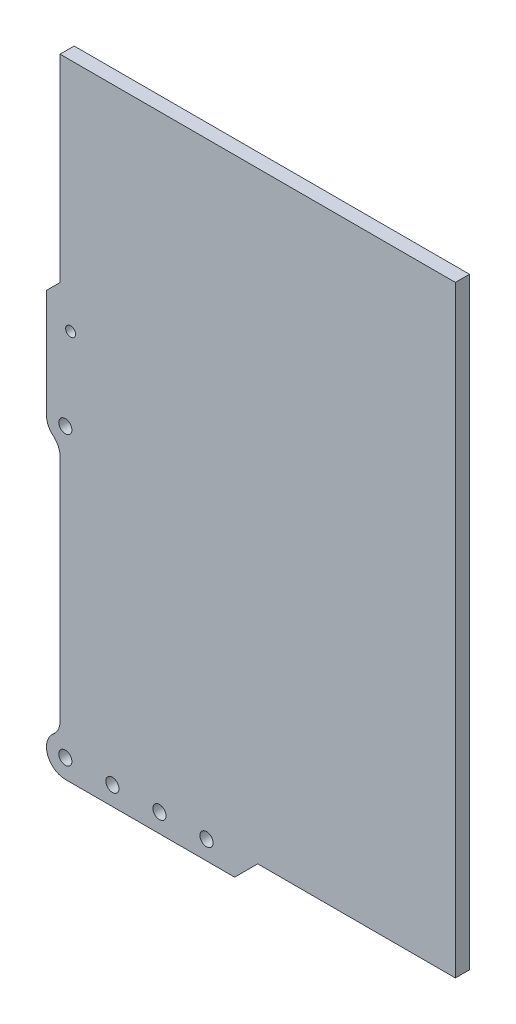
ISO-10303-21;
HEADER;
FILE_DESCRIPTION(('STEP AP214'),'2;1');
FILE_NAME('part.step','',(''),(''),'','','');
FILE_SCHEMA(('AUTOMOTIVE_DESIGN { 1 0 10303 214 1 1 1 1 }'));
ENDSEC;
DATA;
#1=APPLICATION_CONTEXT('core data for automotive mechanical design processes');
#2=APPLICATION_PROTOCOL_DEFINITION('international standard','automotive_design',2000,#1);
#3=PRODUCT_CONTEXT('',#1,'mechanical');
#4=PRODUCT('Part','Part','',(#3));
#5=PRODUCT_RELATED_PRODUCT_CATEGORY('part','',(#4));
#6=PRODUCT_DEFINITION_FORMATION('','',#4);
#7=PRODUCT_DEFINITION_CONTEXT('part definition',#1,'design');
#8=PRODUCT_DEFINITION('design','',#6,#7);
#9=PRODUCT_DEFINITION_SHAPE('','',#8);
#10=(LENGTH_UNIT() NAMED_UNIT(*) SI_UNIT(.MILLI.,.METRE.));
#11=(NAMED_UNIT(*) PLANE_ANGLE_UNIT() SI_UNIT($,.RADIAN.));
#12=(NAMED_UNIT(*) SI_UNIT($,.STERADIAN.) SOLID_ANGLE_UNIT());
#13=UNCERTAINTY_MEASURE_WITH_UNIT(LENGTH_MEASURE(1.E-05),#10,'distance_accuracy_value','');
#14=(GEOMETRIC_REPRESENTATION_CONTEXT(3) GLOBAL_UNCERTAINTY_ASSIGNED_CONTEXT((#13)) GLOBAL_UNIT_ASSIGNED_CONTEXT((#10,
#11,#12)) REPRESENTATION_CONTEXT('',''));
#15=CARTESIAN_POINT('',(0.,0.,0.));
#16=DIRECTION('',(0.,0.,1.));
#17=DIRECTION('',(1.,0.,0.));
#18=AXIS2_PLACEMENT_3D('',#15,#16,#17);
#19=CARTESIAN_POINT('',(1.12,60.1,0.));
#20=DIRECTION('',(0.,0.,1.));
#21=DIRECTION('',(1.,0.,0.));
#22=AXIS2_PLACEMENT_3D('',#19,#20,#21);
#23=PLANE('',#22);
#24=CARTESIAN_POINT('',(31.12,-0.900000000000001,0.));
#25=DIRECTION('',(0.,0.,-1.));
#26=DIRECTION('',(-1.,0.,0.));
#27=AXIS2_PLACEMENT_3D('',#24,#25,#26);
#28=CIRCLE('',#27,1.4);
#29=CARTESIAN_POINT('',(29.72,-0.900000000000001,0.));
#30=VERTEX_POINT('',#29);
#31=EDGE_CURVE('E254',#30,#30,#28,.F.);
#32=ORIENTED_EDGE('',*,*,#31,.T.);
#33=EDGE_LOOP('',(#32));
#34=FACE_BOUND('',#33,.T.);
#35=CARTESIAN_POINT('',(11.12,-0.900000000000001,0.));
#36=DIRECTION('',(0.,0.,-1.));
#37=DIRECTION('',(-1.,0.,0.));
#38=AXIS2_PLACEMENT_3D('',#35,#36,#37);
#39=CIRCLE('',#38,1.4);
#40=CARTESIAN_POINT('',(9.72,-0.900000000000001,0.));
#41=VERTEX_POINT('',#40);
#42=EDGE_CURVE('E257',#41,#41,#39,.F.);
#43=ORIENTED_EDGE('',*,*,#42,.T.);
#44=EDGE_LOOP('',(#43));
#45=FACE_BOUND('',#44,.T.);
#46=CARTESIAN_POINT('',(1.12,-0.900000000000001,0.));
#47=DIRECTION('',(0.,0.,-1.));
#48=DIRECTION('',(-1.,0.,0.));
#49=AXIS2_PLACEMENT_3D('',#46,#47,#48);
#50=CIRCLE('',#49,1.4);
#51=CARTESIAN_POINT('',(-0.279999999999999,-0.900000000000001,0.));
#52=VERTEX_POINT('',#51);
#53=EDGE_CURVE('E200',#52,#52,#50,.F.);
#54=ORIENTED_EDGE('',*,*,#53,.T.);
#55=EDGE_LOOP('',(#54));
#56=FACE_BOUND('',#55,.T.);
#57=DIRECTION('',(1.,0.,0.));
#58=VECTOR('',#57,1.);
#59=CARTESIAN_POINT('',(42.,0.,0.));
#60=LINE('',#59,#58);
#61=CARTESIAN_POINT('',(84.,0.,0.));
#62=VERTEX_POINT('',#61);
#63=CARTESIAN_POINT('',(42.,0.,0.));
#64=VERTEX_POINT('',#63);
#65=EDGE_CURVE('E185',#62,#64,#60,.F.);
#66=ORIENTED_EDGE('',*,*,#65,.T.);
#67=DIRECTION('',(-0.707106781186547,-0.707106781186549,0.));
#68=VECTOR('',#67,1.);
#69=CARTESIAN_POINT('',(37.1,-4.9,0.));
#70=LINE('',#69,#68);
#71=CARTESIAN_POINT('',(37.1,-4.9,0.));
#72=VERTEX_POINT('',#71);
#73=EDGE_CURVE('E210',#64,#72,#70,.T.);
#74=ORIENTED_EDGE('',*,*,#73,.T.);
#75=DIRECTION('',(-1.,0.,0.));
#76=VECTOR('',#75,1.);
#77=CARTESIAN_POINT('',(1.12,-4.9,0.));
#78=LINE('',#77,#76);
#79=CARTESIAN_POINT('',(1.12,-4.9,0.));
#80=VERTEX_POINT('',#79);
#81=EDGE_CURVE('E203',#72,#80,#78,.T.);
#82=ORIENTED_EDGE('',*,*,#81,.T.);
#83=CARTESIAN_POINT('',(1.12,-0.900000000000001,0.));
#84=DIRECTION('',(0.,0.,-1.));
#85=DIRECTION('',(-1.,0.,0.));
#86=AXIS2_PLACEMENT_3D('',#83,#84,#85);
#87=CIRCLE('',#86,4.);
#88=CARTESIAN_POINT('',(-1.44,2.17349963396777,0.));
#89=VERTEX_POINT('',#88);
#90=EDGE_CURVE('E262',#89,#80,#87,.F.);
#91=ORIENTED_EDGE('',*,*,#90,.F.);
#92=CARTESIAN_POINT('',(-4.,5.24699926793553,0.));
#93=DIRECTION('',(0.,0.,-1.));
#94=DIRECTION('',(-1.,0.,0.));
#95=AXIS2_PLACEMENT_3D('',#92,#93,#94);
#96=CIRCLE('',#95,4.);
#97=CARTESIAN_POINT('',(0.,5.24699926793553,0.));
#98=VERTEX_POINT('',#97);
#99=EDGE_CURVE('E265',#89,#98,#96,.F.);
#100=ORIENTED_EDGE('',*,*,#99,.T.);
#101=DIRECTION('',(0.,1.,0.));
#102=VECTOR('',#101,1.);
#103=CARTESIAN_POINT('',(0.,53.9530007320645,0.));
#104=LINE('',#103,#102);
#105=CARTESIAN_POINT('',(0.,53.9530007320645,0.));
#106=VERTEX_POINT('',#105);
#107=EDGE_CURVE('E126',#98,#106,#104,.T.);
#108=ORIENTED_EDGE('',*,*,#107,.T.);
#109=CARTESIAN_POINT('',(-4.,53.9530007320645,0.));
#110=DIRECTION('',(0.,0.,-1.));
#111=DIRECTION('',(-1.,0.,0.));
#112=AXIS2_PLACEMENT_3D('',#109,#110,#111);
#113=CIRCLE('',#112,4.);
#114=CARTESIAN_POINT('',(-1.44,57.0265003660322,0.));
#115=VERTEX_POINT('',#114);
#116=EDGE_CURVE('E122',#106,#115,#113,.F.);
#117=ORIENTED_EDGE('',*,*,#116,.T.);
#118=CARTESIAN_POINT('',(1.12,60.1,0.));
#119=DIRECTION('',(0.,0.,-1.));
#120=DIRECTION('',(-1.,0.,0.));
#121=AXIS2_PLACEMENT_3D('',#118,#119,#120);
#122=CIRCLE('',#121,3.99999999999999);
#123=CARTESIAN_POINT('',(-2.87999999999999,60.1,0.));
#124=VERTEX_POINT('',#123);
#125=EDGE_CURVE('E109',#124,#115,#122,.F.);
#126=ORIENTED_EDGE('',*,*,#125,.F.);
#127=DIRECTION('',(0.,1.,0.));
#128=VECTOR('',#127,1.);
#129=CARTESIAN_POINT('',(-2.87999999999998,67.1,0.));
#130=LINE('',#129,#128);
#131=CARTESIAN_POINT('',(-2.87999999999995,83.1,0.));
#132=VERTEX_POINT('',#131);
#133=EDGE_CURVE('E119',#124,#132,#130,.T.);
#134=ORIENTED_EDGE('',*,*,#133,.T.);
#135=DIRECTION('',(0.707106781186544,0.707106781186551,0.));
#136=VECTOR('',#135,1.);
#137=CARTESIAN_POINT('',(-2.87999999999997,83.1,0.));
#138=LINE('',#137,#136);
#139=CARTESIAN_POINT('',(0.,85.98,0.));
#140=VERTEX_POINT('',#139);
#141=EDGE_CURVE('E142',#132,#140,#138,.T.);
#142=ORIENTED_EDGE('',*,*,#141,.T.);
#143=DIRECTION('',(0.,1.,0.));
#144=VECTOR('',#143,1.);
#145=CARTESIAN_POINT('',(0.,128.,0.));
#146=LINE('',#145,#144);
#147=CARTESIAN_POINT('',(0.,128.,0.));
#148=VERTEX_POINT('',#147);
#149=EDGE_CURVE('E154',#140,#148,#146,.T.);
#150=ORIENTED_EDGE('',*,*,#149,.T.);
#151=DIRECTION('',(1.,0.,0.));
#152=VECTOR('',#151,1.);
#153=CARTESIAN_POINT('',(0.,128.,0.));
#154=LINE('',#153,#152);
#155=CARTESIAN_POINT('',(84.,128.,0.));
#156=VERTEX_POINT('',#155);
#157=EDGE_CURVE('E164',#148,#156,#154,.T.);
#158=ORIENTED_EDGE('',*,*,#157,.T.);
#159=DIRECTION('',(0.,1.,0.));
#160=VECTOR('',#159,1.);
#161=CARTESIAN_POINT('',(84.,0.,0.));
#162=LINE('',#161,#160);
#163=EDGE_CURVE('E174',#156,#62,#162,.F.);
#164=ORIENTED_EDGE('',*,*,#163,.T.);
#165=EDGE_LOOP('',(#66,#74,#82,#91,#100,#108,#117,#126,#134,#142,#150,#158,#164));
#166=FACE_BOUND('',#165,.T.);
#167=CARTESIAN_POINT('',(1.12,60.1,0.));
#168=DIRECTION('',(0.,0.,-1.));
#169=DIRECTION('',(-1.,0.,0.));
#170=AXIS2_PLACEMENT_3D('',#167,#168,#169);
#171=CIRCLE('',#170,1.4);
#172=CARTESIAN_POINT('',(-0.279999999999999,60.1,0.));
#173=VERTEX_POINT('',#172);
#174=EDGE_CURVE('E196',#173,#173,#171,.F.);
#175=ORIENTED_EDGE('',*,*,#174,.T.);
#176=EDGE_LOOP('',(#175));
#177=FACE_BOUND('',#176,.T.);
#178=CARTESIAN_POINT('',(21.12,-0.900000000000001,0.));
#179=DIRECTION('',(0.,0.,-1.));
#180=DIRECTION('',(-1.,0.,0.));
#181=AXIS2_PLACEMENT_3D('',#178,#179,#180);
#182=CIRCLE('',#181,1.4);
#183=CARTESIAN_POINT('',(19.72,-0.900000000000001,0.));
#184=VERTEX_POINT('',#183);
#185=EDGE_CURVE('E268',#184,#184,#182,.F.);
#186=ORIENTED_EDGE('',*,*,#185,.T.);
#187=EDGE_LOOP('',(#186));
#188=FACE_BOUND('',#187,.T.);
#189=CARTESIAN_POINT('',(2.24065736562365,78.099836862285,0.));
#190=DIRECTION('',(0.,0.,1.));
#191=DIRECTION('',(1.,0.,0.));
#192=AXIS2_PLACEMENT_3D('',#189,#190,#191);
#193=CIRCLE('',#192,1.05);
#194=CARTESIAN_POINT('',(3.29065736562365,78.099836862285,0.));
#195=VERTEX_POINT('',#194);
#196=EDGE_CURVE('E19',#195,#195,#193,.T.);
#197=ORIENTED_EDGE('',*,*,#196,.T.);
#198=EDGE_LOOP('',(#197));
#199=FACE_BOUND('',#198,.T.);
#200=ADVANCED_FACE('F16',(#34,#45,#56,#166,#177,#188,#199),#23,.F.);
#201=CARTESIAN_POINT('',(2.24065736562365,78.099836862285,-0.00100000000000013));
#202=DIRECTION('',(0.,0.,1.));
#203=DIRECTION('',(1.,0.,0.));
#204=AXIS2_PLACEMENT_3D('',#201,#202,#203);
#205=CYLINDRICAL_SURFACE('',#204,1.05);
#206=CARTESIAN_POINT('',(2.24065736562365,78.099836862285,3.));
#207=DIRECTION('',(0.,0.,1.));
#208=DIRECTION('',(1.,0.,0.));
#209=AXIS2_PLACEMENT_3D('',#206,#207,#208);
#210=CIRCLE('',#209,1.05);
#211=CARTESIAN_POINT('',(3.29065736562365,78.099836862285,3.));
#212=VERTEX_POINT('',#211);
#213=EDGE_CURVE('E251',#212,#212,#210,.F.);
#214=ORIENTED_EDGE('',*,*,#213,.F.);
#215=EDGE_LOOP('',(#214));
#216=FACE_BOUND('',#215,.T.);
#217=ORIENTED_EDGE('',*,*,#196,.F.);
#218=EDGE_LOOP('',(#217));
#219=FACE_BOUND('',#218,.T.);
#220=ADVANCED_FACE('F276',(#216,#219),#205,.F.);
#221=CARTESIAN_POINT('',(21.12,-0.900000000000001,3.));
#222=DIRECTION('',(0.,0.,-1.));
#223=DIRECTION('',(-1.,0.,0.));
#224=AXIS2_PLACEMENT_3D('',#221,#222,#223);
#225=CYLINDRICAL_SURFACE('',#224,1.4);
#226=CARTESIAN_POINT('',(21.12,-0.900000000000001,3.));
#227=DIRECTION('',(0.,0.,-1.));
#228=DIRECTION('',(-1.,0.,0.));
#229=AXIS2_PLACEMENT_3D('',#226,#227,#228);
#230=CIRCLE('',#229,1.4);
#231=CARTESIAN_POINT('',(19.72,-0.900000000000001,3.));
#232=VERTEX_POINT('',#231);
#233=EDGE_CURVE('E248',#232,#232,#230,.T.);
#234=ORIENTED_EDGE('',*,*,#233,.F.);
#235=EDGE_LOOP('',(#234));
#236=FACE_BOUND('',#235,.T.);
#237=ORIENTED_EDGE('',*,*,#185,.F.);
#238=EDGE_LOOP('',(#237));
#239=FACE_BOUND('',#238,.T.);
#240=ADVANCED_FACE('F278',(#236,#239),#225,.F.);
#241=CARTESIAN_POINT('',(1.12,60.1,3.));
#242=DIRECTION('',(0.,0.,-1.));
#243=DIRECTION('',(-1.,0.,0.));
#244=AXIS2_PLACEMENT_3D('',#241,#242,#243);
#245=CYLINDRICAL_SURFACE('',#244,1.4);
#246=CARTESIAN_POINT('',(1.12,60.1,3.));
#247=DIRECTION('',(0.,0.,-1.));
#248=DIRECTION('',(-1.,0.,0.));
#249=AXIS2_PLACEMENT_3D('',#246,#247,#248);
#250=CIRCLE('',#249,1.4);
#251=CARTESIAN_POINT('',(-0.279999999999999,60.1,3.));
#252=VERTEX_POINT('',#251);
#253=EDGE_CURVE('E179',#252,#252,#250,.T.);
#254=ORIENTED_EDGE('',*,*,#253,.F.);
#255=EDGE_LOOP('',(#254));
#256=FACE_BOUND('',#255,.T.);
#257=ORIENTED_EDGE('',*,*,#174,.F.);
#258=EDGE_LOOP('',(#257));
#259=FACE_BOUND('',#258,.T.);
#260=ADVANCED_FACE('F285',(#256,#259),#245,.F.);
#261=CARTESIAN_POINT('',(84.,0.,3.));
#262=DIRECTION('',(-1.,0.,0.));
#263=DIRECTION('',(0.,0.,1.));
#264=AXIS2_PLACEMENT_3D('',#261,#262,#263);
#265=PLANE('',#264);
#266=DIRECTION('',(0.,0.,-1.));
#267=VECTOR('',#266,1.);
#268=CARTESIAN_POINT('',(84.,128.,3.));
#269=LINE('',#268,#267);
#270=CARTESIAN_POINT('',(84.,128.,3.));
#271=VERTEX_POINT('',#270);
#272=EDGE_CURVE('E172',#156,#271,#269,.F.);
#273=ORIENTED_EDGE('',*,*,#272,.T.);
#274=DIRECTION('',(0.,1.,0.));
#275=VECTOR('',#274,1.);
#276=CARTESIAN_POINT('',(84.,60.1,3.));
#277=LINE('',#276,#275);
#278=CARTESIAN_POINT('',(84.,0.,3.));
#279=VERTEX_POINT('',#278);
#280=EDGE_CURVE('E169',#279,#271,#277,.T.);
#281=ORIENTED_EDGE('',*,*,#280,.F.);
#282=DIRECTION('',(0.,0.,1.));
#283=VECTOR('',#282,1.);
#284=CARTESIAN_POINT('',(84.,0.,3.));
#285=LINE('',#284,#283);
#286=EDGE_CURVE('E182',#279,#62,#285,.F.);
#287=ORIENTED_EDGE('',*,*,#286,.T.);
#288=ORIENTED_EDGE('',*,*,#163,.F.);
#289=EDGE_LOOP('',(#273,#281,#287,#288));
#290=FACE_BOUND('',#289,.T.);
#291=ADVANCED_FACE('F352',(#290),#265,.F.);
#292=CARTESIAN_POINT('',(0.,128.,3.));
#293=DIRECTION('',(0.,-1.,0.));
#294=DIRECTION('',(0.,0.,-1.));
#295=AXIS2_PLACEMENT_3D('',#292,#293,#294);
#296=PLANE('',#295);
#297=DIRECTION('',(0.,0.,-1.));
#298=VECTOR('',#297,1.);
#299=CARTESIAN_POINT('',(0.,128.,3.));
#300=LINE('',#299,#298);
#301=CARTESIAN_POINT('',(0.,128.,3.));
#302=VERTEX_POINT('',#301);
#303=EDGE_CURVE('E162',#148,#302,#300,.F.);
#304=ORIENTED_EDGE('',*,*,#303,.T.);
#305=DIRECTION('',(1.,0.,0.));
#306=VECTOR('',#305,1.);
#307=CARTESIAN_POINT('',(1.12,128.,3.));
#308=LINE('',#307,#306);
#309=EDGE_CURVE('E159',#271,#302,#308,.F.);
#310=ORIENTED_EDGE('',*,*,#309,.F.);
#311=ORIENTED_EDGE('',*,*,#272,.F.);
#312=ORIENTED_EDGE('',*,*,#157,.F.);
#313=EDGE_LOOP('',(#304,#310,#311,#312));
#314=FACE_BOUND('',#313,.T.);
#315=ADVANCED_FACE('F348',(#314),#296,.F.);
#316=CARTESIAN_POINT('',(0.,128.,3.));
#317=DIRECTION('',(1.,0.,0.));
#318=DIRECTION('',(0.,0.,-1.));
#319=AXIS2_PLACEMENT_3D('',#316,#317,#318);
#320=PLANE('',#319);
#321=DIRECTION('',(0.,0.,1.));
#322=VECTOR('',#321,1.);
#323=CARTESIAN_POINT('',(0.,85.98,3.));
#324=LINE('',#323,#322);
#325=CARTESIAN_POINT('',(0.,85.98,3.));
#326=VERTEX_POINT('',#325);
#327=EDGE_CURVE('E152',#140,#326,#324,.T.);
#328=ORIENTED_EDGE('',*,*,#327,.T.);
#329=DIRECTION('',(0.,1.,0.));
#330=VECTOR('',#329,1.);
#331=CARTESIAN_POINT('',(0.,60.1,3.));
#332=LINE('',#331,#330);
#333=EDGE_CURVE('E149',#302,#326,#332,.F.);
#334=ORIENTED_EDGE('',*,*,#333,.F.);
#335=ORIENTED_EDGE('',*,*,#303,.F.);
#336=ORIENTED_EDGE('',*,*,#149,.F.);
#337=EDGE_LOOP('',(#328,#334,#335,#336));
#338=FACE_BOUND('',#337,.T.);
#339=ADVANCED_FACE('F344',(#338),#320,.F.);
#340=CARTESIAN_POINT('',(-2.87999999999997,83.1,3.));
#341=DIRECTION('',(0.707106781186551,-0.707106781186544,0.));
#342=DIRECTION('',(0.707106781186544,0.707106781186551,0.));
#343=AXIS2_PLACEMENT_3D('',#340,#341,#342);
#344=PLANE('',#343);
#345=DIRECTION('',(0.,0.,1.));
#346=VECTOR('',#345,1.);
#347=CARTESIAN_POINT('',(-2.87999999999993,83.1,3.));
#348=LINE('',#347,#346);
#349=CARTESIAN_POINT('',(-2.87999999999996,83.1,3.));
#350=VERTEX_POINT('',#349);
#351=EDGE_CURVE('E140',#132,#350,#348,.T.);
#352=ORIENTED_EDGE('',*,*,#351,.T.);
#353=DIRECTION('',(-0.707106781186544,-0.707106781186552,0.));
#354=VECTOR('',#353,1.);
#355=CARTESIAN_POINT('',(0.,85.98,3.));
#356=LINE('',#355,#354);
#357=EDGE_CURVE('E145',#326,#350,#356,.T.);
#358=ORIENTED_EDGE('',*,*,#357,.F.);
#359=ORIENTED_EDGE('',*,*,#327,.F.);
#360=ORIENTED_EDGE('',*,*,#141,.F.);
#361=EDGE_LOOP('',(#352,#358,#359,#360));
#362=FACE_BOUND('',#361,.T.);
#363=ADVANCED_FACE('F340',(#362),#344,.F.);
#364=CARTESIAN_POINT('',(-2.87999999999998,67.1,3.));
#365=DIRECTION('',(1.,0.,0.));
#366=DIRECTION('',(0.,1.,0.));
#367=AXIS2_PLACEMENT_3D('',#364,#365,#366);
#368=PLANE('',#367);
#369=DIRECTION('',(0.,0.,-1.));
#370=VECTOR('',#369,1.);
#371=CARTESIAN_POINT('',(-2.87999999999999,60.1,3.));
#372=LINE('',#371,#370);
#373=CARTESIAN_POINT('',(-2.87999999999998,60.1,3.));
#374=VERTEX_POINT('',#373);
#375=EDGE_CURVE('E118',#374,#124,#372,.T.);
#376=ORIENTED_EDGE('',*,*,#375,.F.);
#377=DIRECTION('',(0.,1.,0.));
#378=VECTOR('',#377,1.);
#379=CARTESIAN_POINT('',(-2.87999999999997,60.1,3.));
#380=LINE('',#379,#378);
#381=EDGE_CURVE('E148',#350,#374,#380,.F.);
#382=ORIENTED_EDGE('',*,*,#381,.F.);
#383=ORIENTED_EDGE('',*,*,#351,.F.);
#384=ORIENTED_EDGE('',*,*,#133,.F.);
#385=EDGE_LOOP('',(#376,#382,#383,#384));
#386=FACE_BOUND('',#385,.T.);
#387=ADVANCED_FACE('F337',(#386),#368,.F.);
#388=CARTESIAN_POINT('',(1.12,60.1,3.));
#389=DIRECTION('',(0.,0.,-1.));
#390=DIRECTION('',(-1.,0.,0.));
#391=AXIS2_PLACEMENT_3D('',#388,#389,#390);
#392=CYLINDRICAL_SURFACE('',#391,3.99999999999999);
#393=CARTESIAN_POINT('',(1.12,60.1,3.));
#394=DIRECTION('',(0.,0.,-1.));
#395=DIRECTION('',(-1.,0.,0.));
#396=AXIS2_PLACEMENT_3D('',#393,#394,#395);
#397=CIRCLE('',#396,3.99999999999999);
#398=CARTESIAN_POINT('',(-1.44,57.0265003660322,3.));
#399=VERTEX_POINT('',#398);
#400=EDGE_CURVE('E244',#374,#399,#397,.F.);
#401=ORIENTED_EDGE('',*,*,#400,.F.);
#402=ORIENTED_EDGE('',*,*,#375,.T.);
#403=ORIENTED_EDGE('',*,*,#125,.T.);
#404=DIRECTION('',(0.,0.,-1.));
#405=VECTOR('',#404,1.);
#406=CARTESIAN_POINT('',(-1.44,57.0265003660322,3.));
#407=LINE('',#406,#405);
#408=EDGE_CURVE('E116',#115,#399,#407,.F.);
#409=ORIENTED_EDGE('',*,*,#408,.T.);
#410=EDGE_LOOP('',(#401,#402,#403,#409));
#411=FACE_BOUND('',#410,.T.);
#412=ADVANCED_FACE('F114',(#411),#392,.T.);
#413=CARTESIAN_POINT('',(-4.,53.9530007320645,3.));
#414=DIRECTION('',(0.,0.,-1.));
#415=DIRECTION('',(-1.,0.,0.));
#416=AXIS2_PLACEMENT_3D('',#413,#414,#415);
#417=CYLINDRICAL_SURFACE('',#416,4.);
#418=DIRECTION('',(0.,0.,-1.));
#419=VECTOR('',#418,1.);
#420=CARTESIAN_POINT('',(0.,53.9530007320645,3.));
#421=LINE('',#420,#419);
#422=CARTESIAN_POINT('',(0.,53.9530007320645,3.));
#423=VERTEX_POINT('',#422);
#424=EDGE_CURVE('E129',#106,#423,#421,.F.);
#425=ORIENTED_EDGE('',*,*,#424,.T.);
#426=CARTESIAN_POINT('',(-4.,53.9530007320645,3.));
#427=DIRECTION('',(0.,0.,-1.));
#428=DIRECTION('',(-1.,0.,0.));
#429=AXIS2_PLACEMENT_3D('',#426,#427,#428);
#430=CIRCLE('',#429,4.);
#431=EDGE_CURVE('E133',#399,#423,#430,.T.);
#432=ORIENTED_EDGE('',*,*,#431,.F.);
#433=ORIENTED_EDGE('',*,*,#408,.F.);
#434=ORIENTED_EDGE('',*,*,#116,.F.);
#435=EDGE_LOOP('',(#425,#432,#433,#434));
#436=FACE_BOUND('',#435,.T.);
#437=ADVANCED_FACE('F131',(#436),#417,.F.);
#438=CARTESIAN_POINT('',(0.,53.9530007320645,3.));
#439=DIRECTION('',(1.,0.,0.));
#440=DIRECTION('',(0.,0.,-1.));
#441=AXIS2_PLACEMENT_3D('',#438,#439,#440);
#442=PLANE('',#441);
#443=DIRECTION('',(0.,0.,-1.));
#444=VECTOR('',#443,1.);
#445=CARTESIAN_POINT('',(0.,5.24699926793553,3.));
#446=LINE('',#445,#444);
#447=CARTESIAN_POINT('',(0.,5.24699926793553,3.));
#448=VERTEX_POINT('',#447);
#449=EDGE_CURVE('E216',#98,#448,#446,.F.);
#450=ORIENTED_EDGE('',*,*,#449,.T.);
#451=DIRECTION('',(0.,1.,0.));
#452=VECTOR('',#451,1.);
#453=CARTESIAN_POINT('',(0.,60.1,3.));
#454=LINE('',#453,#452);
#455=EDGE_CURVE('E242',#423,#448,#454,.F.);
#456=ORIENTED_EDGE('',*,*,#455,.F.);
#457=ORIENTED_EDGE('',*,*,#424,.F.);
#458=ORIENTED_EDGE('',*,*,#107,.F.);
#459=EDGE_LOOP('',(#450,#456,#457,#458));
#460=FACE_BOUND('',#459,.T.);
#461=ADVANCED_FACE('F328',(#460),#442,.F.);
#462=CARTESIAN_POINT('',(-4.,5.24699926793553,3.));
#463=DIRECTION('',(0.,0.,-1.));
#464=DIRECTION('',(-1.,0.,0.));
#465=AXIS2_PLACEMENT_3D('',#462,#463,#464);
#466=CYLINDRICAL_SURFACE('',#465,4.);
#467=DIRECTION('',(0.,0.,-1.));
#468=VECTOR('',#467,1.);
#469=CARTESIAN_POINT('',(-1.44,2.17349963396777,3.));
#470=LINE('',#469,#468);
#471=CARTESIAN_POINT('',(-1.44,2.17349963396777,3.));
#472=VERTEX_POINT('',#471);
#473=EDGE_CURVE('E264',#472,#89,#470,.T.);
#474=ORIENTED_EDGE('',*,*,#473,.F.);
#475=CARTESIAN_POINT('',(-4.,5.24699926793553,3.));
#476=DIRECTION('',(0.,0.,-1.));
#477=DIRECTION('',(-1.,0.,0.));
#478=AXIS2_PLACEMENT_3D('',#475,#476,#477);
#479=CIRCLE('',#478,4.);
#480=EDGE_CURVE('E239',#448,#472,#479,.T.);
#481=ORIENTED_EDGE('',*,*,#480,.F.);
#482=ORIENTED_EDGE('',*,*,#449,.F.);
#483=ORIENTED_EDGE('',*,*,#99,.F.);
#484=EDGE_LOOP('',(#474,#481,#482,#483));
#485=FACE_BOUND('',#484,.T.);
#486=ADVANCED_FACE('F324',(#485),#466,.F.);
#487=CARTESIAN_POINT('',(1.12,-0.900000000000001,3.));
#488=DIRECTION('',(0.,0.,-1.));
#489=DIRECTION('',(-1.,0.,0.));
#490=AXIS2_PLACEMENT_3D('',#487,#488,#489);
#491=CYLINDRICAL_SURFACE('',#490,4.);
#492=ORIENTED_EDGE('',*,*,#90,.T.);
#493=DIRECTION('',(0.,0.,1.));
#494=VECTOR('',#493,1.);
#495=CARTESIAN_POINT('',(1.12,-4.9,3.));
#496=LINE('',#495,#494);
#497=CARTESIAN_POINT('',(1.12,-4.9,3.));
#498=VERTEX_POINT('',#497);
#499=EDGE_CURVE('E207',#80,#498,#496,.T.);
#500=ORIENTED_EDGE('',*,*,#499,.T.);
#501=CARTESIAN_POINT('',(1.12,-0.900000000000001,3.));
#502=DIRECTION('',(0.,0.,-1.));
#503=DIRECTION('',(-1.,0.,0.));
#504=AXIS2_PLACEMENT_3D('',#501,#502,#503);
#505=CIRCLE('',#504,4.);
#506=EDGE_CURVE('E236',#472,#498,#505,.F.);
#507=ORIENTED_EDGE('',*,*,#506,.F.);
#508=ORIENTED_EDGE('',*,*,#473,.T.);
#509=EDGE_LOOP('',(#492,#500,#507,#508));
#510=FACE_BOUND('',#509,.T.);
#511=ADVANCED_FACE('F320',(#510),#491,.T.);
#512=CARTESIAN_POINT('',(1.12,-4.9,3.));
#513=DIRECTION('',(0.,1.,0.));
#514=DIRECTION('',(-1.,0.,0.));
#515=AXIS2_PLACEMENT_3D('',#512,#513,#514);
#516=PLANE('',#515);
#517=DIRECTION('',(0.,0.,1.));
#518=VECTOR('',#517,1.);
#519=CARTESIAN_POINT('',(37.1,-4.9,3.));
#520=LINE('',#519,#518);
#521=CARTESIAN_POINT('',(37.1,-4.9,3.));
#522=VERTEX_POINT('',#521);
#523=EDGE_CURVE('E206',#72,#522,#520,.T.);
#524=ORIENTED_EDGE('',*,*,#523,.T.);
#525=DIRECTION('',(1.,0.,0.));
#526=VECTOR('',#525,1.);
#527=CARTESIAN_POINT('',(1.12,-4.9,3.));
#528=LINE('',#527,#526);
#529=EDGE_CURVE('E238',#498,#522,#528,.T.);
#530=ORIENTED_EDGE('',*,*,#529,.F.);
#531=ORIENTED_EDGE('',*,*,#499,.F.);
#532=ORIENTED_EDGE('',*,*,#81,.F.);
#533=EDGE_LOOP('',(#524,#530,#531,#532));
#534=FACE_BOUND('',#533,.T.);
#535=ADVANCED_FACE('F317',(#534),#516,.F.);
#536=CARTESIAN_POINT('',(37.1,-4.9,3.));
#537=DIRECTION('',(-0.707106781186549,0.707106781186547,0.));
#538=DIRECTION('',(-0.707106781186547,-0.707106781186549,0.));
#539=AXIS2_PLACEMENT_3D('',#536,#537,#538);
#540=PLANE('',#539);
#541=DIRECTION('',(0.,0.,1.));
#542=VECTOR('',#541,1.);
#543=CARTESIAN_POINT('',(42.,0.,3.));
#544=LINE('',#543,#542);
#545=CARTESIAN_POINT('',(42.,0.,3.));
#546=VERTEX_POINT('',#545);
#547=EDGE_CURVE('E34',#64,#546,#544,.T.);
#548=ORIENTED_EDGE('',*,*,#547,.T.);
#549=DIRECTION('',(0.707106781186547,0.707106781186549,0.));
#550=VECTOR('',#549,1.);
#551=CARTESIAN_POINT('',(37.1,-4.9,3.));
#552=LINE('',#551,#550);
#553=EDGE_CURVE('E192',#522,#546,#552,.T.);
#554=ORIENTED_EDGE('',*,*,#553,.F.);
#555=ORIENTED_EDGE('',*,*,#523,.F.);
#556=ORIENTED_EDGE('',*,*,#73,.F.);
#557=EDGE_LOOP('',(#548,#554,#555,#556));
#558=FACE_BOUND('',#557,.T.);
#559=ADVANCED_FACE('F313',(#558),#540,.F.);
#560=CARTESIAN_POINT('',(42.,0.,3.));
#561=DIRECTION('',(0.,1.,0.));
#562=DIRECTION('',(0.,0.,1.));
#563=AXIS2_PLACEMENT_3D('',#560,#561,#562);
#564=PLANE('',#563);
#565=ORIENTED_EDGE('',*,*,#286,.F.);
#566=DIRECTION('',(1.,0.,0.));
#567=VECTOR('',#566,1.);
#568=CARTESIAN_POINT('',(1.12,0.,3.));
#569=LINE('',#568,#567);
#570=EDGE_CURVE('E188',#546,#279,#569,.T.);
#571=ORIENTED_EDGE('',*,*,#570,.F.);
#572=ORIENTED_EDGE('',*,*,#547,.F.);
#573=ORIENTED_EDGE('',*,*,#65,.F.);
#574=EDGE_LOOP('',(#565,#571,#572,#573));
#575=FACE_BOUND('',#574,.T.);
#576=ADVANCED_FACE('F309',(#575),#564,.F.);
#577=CARTESIAN_POINT('',(1.12,-0.900000000000001,3.));
#578=DIRECTION('',(0.,0.,-1.));
#579=DIRECTION('',(-1.,0.,0.));
#580=AXIS2_PLACEMENT_3D('',#577,#578,#579);
#581=CYLINDRICAL_SURFACE('',#580,1.4);
#582=CARTESIAN_POINT('',(1.12,-0.900000000000001,3.));
#583=DIRECTION('',(0.,0.,-1.));
#584=DIRECTION('',(-1.,0.,0.));
#585=AXIS2_PLACEMENT_3D('',#582,#583,#584);
#586=CIRCLE('',#585,1.4);
#587=CARTESIAN_POINT('',(-0.279999999999999,-0.900000000000001,3.));
#588=VERTEX_POINT('',#587);
#589=EDGE_CURVE('E191',#588,#588,#586,.T.);
#590=ORIENTED_EDGE('',*,*,#589,.F.);
#591=EDGE_LOOP('',(#590));
#592=FACE_BOUND('',#591,.T.);
#593=ORIENTED_EDGE('',*,*,#53,.F.);
#594=EDGE_LOOP('',(#593));
#595=FACE_BOUND('',#594,.T.);
#596=ADVANCED_FACE('F305',(#592,#595),#581,.F.);
#597=CARTESIAN_POINT('',(11.12,-0.900000000000001,3.));
#598=DIRECTION('',(0.,0.,-1.));
#599=DIRECTION('',(-1.,0.,0.));
#600=AXIS2_PLACEMENT_3D('',#597,#598,#599);
#601=CYLINDRICAL_SURFACE('',#600,1.4);
#602=CARTESIAN_POINT('',(11.12,-0.900000000000001,3.));
#603=DIRECTION('',(0.,0.,-1.));
#604=DIRECTION('',(-1.,0.,0.));
#605=AXIS2_PLACEMENT_3D('',#602,#603,#604);
#606=CIRCLE('',#605,1.4);
#607=CARTESIAN_POINT('',(9.72,-0.900000000000001,3.));
#608=VERTEX_POINT('',#607);
#609=EDGE_CURVE('E25',#608,#608,#606,.T.);
#610=ORIENTED_EDGE('',*,*,#609,.F.);
#611=EDGE_LOOP('',(#610));
#612=FACE_BOUND('',#611,.T.);
#613=ORIENTED_EDGE('',*,*,#42,.F.);
#614=EDGE_LOOP('',(#613));
#615=FACE_BOUND('',#614,.T.);
#616=ADVANCED_FACE('F298',(#612,#615),#601,.F.);
#617=CARTESIAN_POINT('',(31.12,-0.900000000000001,3.));
#618=DIRECTION('',(0.,0.,-1.));
#619=DIRECTION('',(-1.,0.,0.));
#620=AXIS2_PLACEMENT_3D('',#617,#618,#619);
#621=CYLINDRICAL_SURFACE('',#620,1.4);
#622=CARTESIAN_POINT('',(31.12,-0.900000000000001,3.));
#623=DIRECTION('',(0.,0.,-1.));
#624=DIRECTION('',(-1.,0.,0.));
#625=AXIS2_PLACEMENT_3D('',#622,#623,#624);
#626=CIRCLE('',#625,1.4);
#627=CARTESIAN_POINT('',(29.72,-0.900000000000001,3.));
#628=VERTEX_POINT('',#627);
#629=EDGE_CURVE('E9',#628,#628,#626,.T.);
#630=ORIENTED_EDGE('',*,*,#629,.F.);
#631=EDGE_LOOP('',(#630));
#632=FACE_BOUND('',#631,.T.);
#633=ORIENTED_EDGE('',*,*,#31,.F.);
#634=EDGE_LOOP('',(#633));
#635=FACE_BOUND('',#634,.T.);
#636=ADVANCED_FACE('F292',(#632,#635),#621,.F.);
#637=CARTESIAN_POINT('',(1.12,60.1,3.));
#638=DIRECTION('',(0.,0.,1.));
#639=DIRECTION('',(1.,0.,0.));
#640=AXIS2_PLACEMENT_3D('',#637,#638,#639);
#641=PLANE('',#640);
#642=ORIENTED_EDGE('',*,*,#629,.T.);
#643=EDGE_LOOP('',(#642));
#644=FACE_BOUND('',#643,.T.);
#645=ORIENTED_EDGE('',*,*,#609,.T.);
#646=EDGE_LOOP('',(#645));
#647=FACE_BOUND('',#646,.T.);
#648=ORIENTED_EDGE('',*,*,#589,.T.);
#649=EDGE_LOOP('',(#648));
#650=FACE_BOUND('',#649,.T.);
#651=ORIENTED_EDGE('',*,*,#553,.T.);
#652=ORIENTED_EDGE('',*,*,#570,.T.);
#653=ORIENTED_EDGE('',*,*,#280,.T.);
#654=ORIENTED_EDGE('',*,*,#309,.T.);
#655=ORIENTED_EDGE('',*,*,#333,.T.);
#656=ORIENTED_EDGE('',*,*,#357,.T.);
#657=ORIENTED_EDGE('',*,*,#381,.T.);
#658=ORIENTED_EDGE('',*,*,#400,.T.);
#659=ORIENTED_EDGE('',*,*,#431,.T.);
#660=ORIENTED_EDGE('',*,*,#455,.T.);
#661=ORIENTED_EDGE('',*,*,#480,.T.);
#662=ORIENTED_EDGE('',*,*,#506,.T.);
#663=ORIENTED_EDGE('',*,*,#529,.T.);
#664=EDGE_LOOP('',(#651,#652,#653,#654,#655,#656,#657,#658,#659,#660,#661,#662,#663));
#665=FACE_BOUND('',#664,.T.);
#666=ORIENTED_EDGE('',*,*,#253,.T.);
#667=EDGE_LOOP('',(#666));
#668=FACE_BOUND('',#667,.T.);
#669=ORIENTED_EDGE('',*,*,#233,.T.);
#670=EDGE_LOOP('',(#669));
#671=FACE_BOUND('',#670,.T.);
#672=ORIENTED_EDGE('',*,*,#213,.T.);
#673=EDGE_LOOP('',(#672));
#674=FACE_BOUND('',#673,.T.);
#675=ADVANCED_FACE('F290',(#644,#647,#650,#665,#668,#671,#674),#641,.T.);
#676=CLOSED_SHELL('',(#200,#220,#240,#260,#291,#315,#339,#363,#387,#412,#437,#461,#486,#511,
#535,#559,#576,#596,#616,#636,#675));
#677=MANIFOLD_SOLID_BREP('B1',#676);
#678=ADVANCED_BREP_SHAPE_REPRESENTATION('',(#18,#677),#14);
#679=SHAPE_DEFINITION_REPRESENTATION(#9,#678);
ENDSEC;
END-ISO-10303-21;
